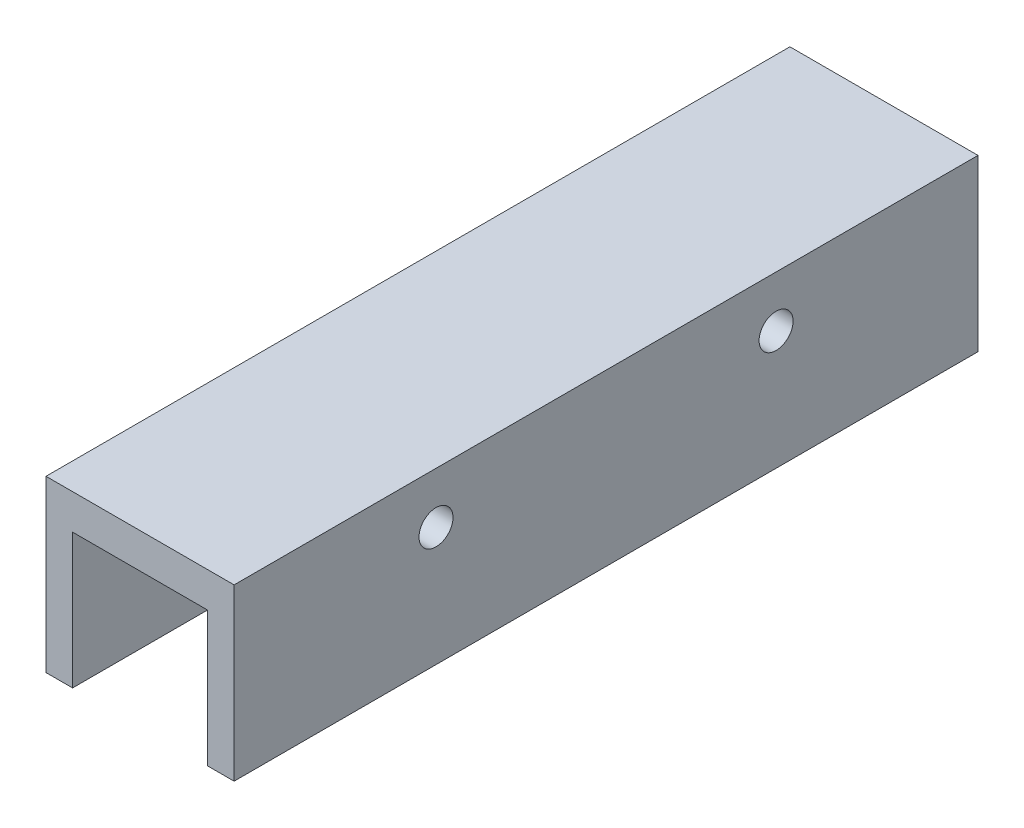
ISO-10303-21;
HEADER;
FILE_DESCRIPTION(('STEP AP214'),'2;1');
FILE_NAME('part.step','',(''),(''),'','','');
FILE_SCHEMA(('AUTOMOTIVE_DESIGN { 1 0 10303 214 1 1 1 1 }'));
ENDSEC;
DATA;
#1=APPLICATION_CONTEXT('core data for automotive mechanical design processes');
#2=APPLICATION_PROTOCOL_DEFINITION('international standard','automotive_design',2000,#1);
#3=PRODUCT_CONTEXT('',#1,'mechanical');
#4=PRODUCT('Part','Part','',(#3));
#5=PRODUCT_RELATED_PRODUCT_CATEGORY('part','',(#4));
#6=PRODUCT_DEFINITION_FORMATION('','',#4);
#7=PRODUCT_DEFINITION_CONTEXT('part definition',#1,'design');
#8=PRODUCT_DEFINITION('design','',#6,#7);
#9=PRODUCT_DEFINITION_SHAPE('','',#8);
#10=(LENGTH_UNIT() NAMED_UNIT(*) SI_UNIT(.MILLI.,.METRE.));
#11=(NAMED_UNIT(*) PLANE_ANGLE_UNIT() SI_UNIT($,.RADIAN.));
#12=(NAMED_UNIT(*) SI_UNIT($,.STERADIAN.) SOLID_ANGLE_UNIT());
#13=UNCERTAINTY_MEASURE_WITH_UNIT(LENGTH_MEASURE(1.E-05),#10,'distance_accuracy_value','');
#14=(GEOMETRIC_REPRESENTATION_CONTEXT(3) GLOBAL_UNCERTAINTY_ASSIGNED_CONTEXT((#13)) GLOBAL_UNIT_ASSIGNED_CONTEXT((#10,
#11,#12)) REPRESENTATION_CONTEXT('',''));
#15=CARTESIAN_POINT('',(0.,0.,0.));
#16=DIRECTION('',(0.,0.,1.));
#17=DIRECTION('',(1.,0.,0.));
#18=AXIS2_PLACEMENT_3D('',#15,#16,#17);
#19=CARTESIAN_POINT('',(3.175,16.129,-88.9));
#20=DIRECTION('',(0.,-1.,0.));
#21=DIRECTION('',(0.,0.,-1.));
#22=AXIS2_PLACEMENT_3D('',#19,#20,#21);
#23=PLANE('',#22);
#24=DIRECTION('',(0.,0.,1.));
#25=VECTOR('',#24,1.);
#26=CARTESIAN_POINT('',(3.175,16.129,-88.9));
#27=LINE('',#26,#25);
#28=CARTESIAN_POINT('',(3.175,16.129,-23.4228939259205));
#29=VERTEX_POINT('',#28);
#30=CARTESIAN_POINT('',(3.175,16.129,0.));
#31=VERTEX_POINT('',#30);
#32=EDGE_CURVE('E162',#29,#31,#27,.T.);
#33=ORIENTED_EDGE('',*,*,#32,.F.);
#34=DIRECTION('',(-1.,0.,0.));
#35=VECTOR('',#34,1.);
#36=CARTESIAN_POINT('',(22.479,16.129,-23.4228939259205));
#37=LINE('',#36,#35);
#38=CARTESIAN_POINT('',(19.304,16.129,-23.4228939259205));
#39=VERTEX_POINT('',#38);
#40=EDGE_CURVE('E63',#29,#39,#37,.F.);
#41=ORIENTED_EDGE('',*,*,#40,.T.);
#42=DIRECTION('',(0.,0.,1.));
#43=VECTOR('',#42,1.);
#44=CARTESIAN_POINT('',(19.304,16.129,-88.9));
#45=LINE('',#44,#43);
#46=CARTESIAN_POINT('',(19.304,16.129,0.));
#47=VERTEX_POINT('',#46);
#48=EDGE_CURVE('E159',#39,#47,#45,.T.);
#49=ORIENTED_EDGE('',*,*,#48,.T.);
#50=DIRECTION('',(1.,0.,0.));
#51=VECTOR('',#50,1.);
#52=CARTESIAN_POINT('',(3.175,16.129,0.));
#53=LINE('',#52,#51);
#54=EDGE_CURVE('E199',#31,#47,#53,.T.);
#55=ORIENTED_EDGE('',*,*,#54,.F.);
#56=EDGE_LOOP('',(#33,#41,#49,#55));
#57=FACE_BOUND('',#56,.T.);
#58=ADVANCED_FACE('F47',(#57),#23,.T.);
#59=CARTESIAN_POINT('',(19.304,16.129,-64.0628939259205));
#60=VERTEX_POINT('',#59);
#61=CARTESIAN_POINT('',(19.304,16.129,-24.8371060740794));
#62=VERTEX_POINT('',#61);
#63=EDGE_CURVE('E165',#60,#62,#45,.T.);
#64=ORIENTED_EDGE('',*,*,#63,.T.);
#65=DIRECTION('',(-1.,0.,0.));
#66=VECTOR('',#65,1.);
#67=CARTESIAN_POINT('',(22.479,16.129,-24.8371060740794));
#68=LINE('',#67,#66);
#69=CARTESIAN_POINT('',(3.175,16.129,-24.8371060740794));
#70=VERTEX_POINT('',#69);
#71=EDGE_CURVE('E244',#62,#70,#68,.T.);
#72=ORIENTED_EDGE('',*,*,#71,.T.);
#73=CARTESIAN_POINT('',(3.175,16.129,-64.0628939259205));
#74=VERTEX_POINT('',#73);
#75=EDGE_CURVE('E160',#74,#70,#27,.T.);
#76=ORIENTED_EDGE('',*,*,#75,.F.);
#77=DIRECTION('',(-1.,0.,0.));
#78=VECTOR('',#77,1.);
#79=CARTESIAN_POINT('',(22.479,16.129,-64.0628939259205));
#80=LINE('',#79,#78);
#81=EDGE_CURVE('E70',#74,#60,#80,.F.);
#82=ORIENTED_EDGE('',*,*,#81,.T.);
#83=EDGE_LOOP('',(#64,#72,#76,#82));
#84=FACE_BOUND('',#83,.T.);
#85=ADVANCED_FACE('F243',(#84),#23,.T.);
#86=CARTESIAN_POINT('',(19.304,16.129,-88.9));
#87=VERTEX_POINT('',#86);
#88=CARTESIAN_POINT('',(19.304,16.129,-65.4771060740795));
#89=VERTEX_POINT('',#88);
#90=EDGE_CURVE('E150',#87,#89,#45,.T.);
#91=ORIENTED_EDGE('',*,*,#90,.T.);
#92=DIRECTION('',(-1.,0.,0.));
#93=VECTOR('',#92,1.);
#94=CARTESIAN_POINT('',(22.479,16.129,-65.4771060740795));
#95=LINE('',#94,#93);
#96=CARTESIAN_POINT('',(3.175,16.129,-65.4771060740795));
#97=VERTEX_POINT('',#96);
#98=EDGE_CURVE('E136',#89,#97,#95,.T.);
#99=ORIENTED_EDGE('',*,*,#98,.T.);
#100=CARTESIAN_POINT('',(3.175,16.129,-88.9));
#101=VERTEX_POINT('',#100);
#102=EDGE_CURVE('E148',#101,#97,#27,.T.);
#103=ORIENTED_EDGE('',*,*,#102,.F.);
#104=DIRECTION('',(1.,0.,0.));
#105=VECTOR('',#104,1.);
#106=CARTESIAN_POINT('',(3.175,16.129,-88.9));
#107=LINE('',#106,#105);
#108=EDGE_CURVE('E261',#101,#87,#107,.T.);
#109=ORIENTED_EDGE('',*,*,#108,.T.);
#110=EDGE_LOOP('',(#91,#99,#103,#109));
#111=FACE_BOUND('',#110,.T.);
#112=ADVANCED_FACE('F146',(#111),#23,.T.);
#113=CARTESIAN_POINT('',(0.,0.,-88.9));
#114=DIRECTION('',(0.,-1.,0.));
#115=DIRECTION('',(0.,0.,-1.));
#116=AXIS2_PLACEMENT_3D('',#113,#114,#115);
#117=PLANE('',#116);
#118=DIRECTION('',(1.,0.,0.));
#119=VECTOR('',#118,1.);
#120=CARTESIAN_POINT('',(0.,0.,0.));
#121=LINE('',#120,#119);
#122=CARTESIAN_POINT('',(0.,0.,0.));
#123=VERTEX_POINT('',#122);
#124=CARTESIAN_POINT('',(3.175,0.,0.));
#125=VERTEX_POINT('',#124);
#126=EDGE_CURVE('E190',#123,#125,#121,.T.);
#127=ORIENTED_EDGE('',*,*,#126,.F.);
#128=DIRECTION('',(0.,0.,1.));
#129=VECTOR('',#128,1.);
#130=CARTESIAN_POINT('',(0.,0.,-88.9));
#131=LINE('',#130,#129);
#132=CARTESIAN_POINT('',(0.,0.,-88.9));
#133=VERTEX_POINT('',#132);
#134=EDGE_CURVE('E143',#133,#123,#131,.T.);
#135=ORIENTED_EDGE('',*,*,#134,.F.);
#136=DIRECTION('',(1.,0.,0.));
#137=VECTOR('',#136,1.);
#138=CARTESIAN_POINT('',(0.,0.,-88.9));
#139=LINE('',#138,#137);
#140=CARTESIAN_POINT('',(3.175,0.,-88.9));
#141=VERTEX_POINT('',#140);
#142=EDGE_CURVE('E223',#133,#141,#139,.T.);
#143=ORIENTED_EDGE('',*,*,#142,.T.);
#144=DIRECTION('',(0.,0.,1.));
#145=VECTOR('',#144,1.);
#146=CARTESIAN_POINT('',(3.175,0.,-88.9));
#147=LINE('',#146,#145);
#148=EDGE_CURVE('E169',#141,#125,#147,.T.);
#149=ORIENTED_EDGE('',*,*,#148,.T.);
#150=EDGE_LOOP('',(#127,#135,#143,#149));
#151=FACE_BOUND('',#150,.T.);
#152=ADVANCED_FACE('F49',(#151),#117,.T.);
#153=CARTESIAN_POINT('',(0.,0.,-88.9));
#154=DIRECTION('',(-1.,0.,0.));
#155=DIRECTION('',(0.,0.,1.));
#156=AXIS2_PLACEMENT_3D('',#153,#154,#155);
#157=PLANE('',#156);
#158=CARTESIAN_POINT('',(0.,14.224,-24.13));
#159=DIRECTION('',(1.,0.,0.));
#160=DIRECTION('',(0.,0.,-1.));
#161=AXIS2_PLACEMENT_3D('',#158,#159,#160);
#162=CIRCLE('',#161,2.032);
#163=CARTESIAN_POINT('',(0.,14.224,-26.162));
#164=VERTEX_POINT('',#163);
#165=EDGE_CURVE('E442',#164,#164,#162,.T.);
#166=ORIENTED_EDGE('',*,*,#165,.T.);
#167=EDGE_LOOP('',(#166));
#168=FACE_BOUND('',#167,.T.);
#169=CARTESIAN_POINT('',(0.,14.224,-64.77));
#170=DIRECTION('',(1.,0.,0.));
#171=DIRECTION('',(0.,0.,-1.));
#172=AXIS2_PLACEMENT_3D('',#169,#170,#171);
#173=CIRCLE('',#172,2.03200000000001);
#174=CARTESIAN_POINT('',(0.,14.224,-66.802));
#175=VERTEX_POINT('',#174);
#176=EDGE_CURVE('E444',#175,#175,#173,.T.);
#177=ORIENTED_EDGE('',*,*,#176,.T.);
#178=EDGE_LOOP('',(#177));
#179=FACE_BOUND('',#178,.T.);
#180=DIRECTION('',(0.,-1.,0.));
#181=VECTOR('',#180,1.);
#182=CARTESIAN_POINT('',(0.,0.,0.));
#183=LINE('',#182,#181);
#184=CARTESIAN_POINT('',(0.,20.32,0.));
#185=VERTEX_POINT('',#184);
#186=EDGE_CURVE('E219',#185,#123,#183,.T.);
#187=ORIENTED_EDGE('',*,*,#186,.F.);
#188=DIRECTION('',(0.,0.,1.));
#189=VECTOR('',#188,1.);
#190=CARTESIAN_POINT('',(0.,20.32,-88.9));
#191=LINE('',#190,#189);
#192=CARTESIAN_POINT('',(0.,20.32,-88.9));
#193=VERTEX_POINT('',#192);
#194=EDGE_CURVE('E226',#193,#185,#191,.T.);
#195=ORIENTED_EDGE('',*,*,#194,.F.);
#196=DIRECTION('',(0.,-1.,0.));
#197=VECTOR('',#196,1.);
#198=CARTESIAN_POINT('',(0.,0.,-88.9));
#199=LINE('',#198,#197);
#200=EDGE_CURVE('E174',#193,#133,#199,.T.);
#201=ORIENTED_EDGE('',*,*,#200,.T.);
#202=ORIENTED_EDGE('',*,*,#134,.T.);
#203=EDGE_LOOP('',(#187,#195,#201,#202));
#204=FACE_BOUND('',#203,.T.);
#205=ADVANCED_FACE('F288',(#168,#179,#204),#157,.T.);
#206=CARTESIAN_POINT('',(0.,20.32,-88.9));
#207=DIRECTION('',(0.,1.,0.));
#208=DIRECTION('',(0.,0.,1.));
#209=AXIS2_PLACEMENT_3D('',#206,#207,#208);
#210=PLANE('',#209);
#211=DIRECTION('',(-1.,0.,0.));
#212=VECTOR('',#211,1.);
#213=CARTESIAN_POINT('',(0.,20.32,0.));
#214=LINE('',#213,#212);
#215=CARTESIAN_POINT('',(22.479,20.32,0.));
#216=VERTEX_POINT('',#215);
#217=EDGE_CURVE('E215',#216,#185,#214,.T.);
#218=ORIENTED_EDGE('',*,*,#217,.F.);
#219=DIRECTION('',(0.,0.,1.));
#220=VECTOR('',#219,1.);
#221=CARTESIAN_POINT('',(22.479,20.32,-88.9));
#222=LINE('',#221,#220);
#223=CARTESIAN_POINT('',(22.479,20.32,-88.9));
#224=VERTEX_POINT('',#223);
#225=EDGE_CURVE('E229',#224,#216,#222,.T.);
#226=ORIENTED_EDGE('',*,*,#225,.F.);
#227=DIRECTION('',(-1.,0.,0.));
#228=VECTOR('',#227,1.);
#229=CARTESIAN_POINT('',(0.,20.32,-88.9));
#230=LINE('',#229,#228);
#231=EDGE_CURVE('E180',#224,#193,#230,.T.);
#232=ORIENTED_EDGE('',*,*,#231,.T.);
#233=ORIENTED_EDGE('',*,*,#194,.T.);
#234=EDGE_LOOP('',(#218,#226,#232,#233));
#235=FACE_BOUND('',#234,.T.);
#236=ADVANCED_FACE('F292',(#235),#210,.T.);
#237=CARTESIAN_POINT('',(22.479,0.,-88.9));
#238=DIRECTION('',(1.,0.,0.));
#239=DIRECTION('',(0.,0.,-1.));
#240=AXIS2_PLACEMENT_3D('',#237,#238,#239);
#241=PLANE('',#240);
#242=CARTESIAN_POINT('',(22.479,14.224,-24.13));
#243=DIRECTION('',(1.,0.,0.));
#244=DIRECTION('',(0.,0.,-1.));
#245=AXIS2_PLACEMENT_3D('',#242,#243,#244);
#246=CIRCLE('',#245,2.032);
#247=CARTESIAN_POINT('',(22.479,14.224,-26.162));
#248=VERTEX_POINT('',#247);
#249=EDGE_CURVE('E152',#248,#248,#246,.T.);
#250=ORIENTED_EDGE('',*,*,#249,.F.);
#251=EDGE_LOOP('',(#250));
#252=FACE_BOUND('',#251,.T.);
#253=CARTESIAN_POINT('',(22.479,14.224,-64.77));
#254=DIRECTION('',(1.,0.,0.));
#255=DIRECTION('',(0.,0.,-1.));
#256=AXIS2_PLACEMENT_3D('',#253,#254,#255);
#257=CIRCLE('',#256,2.03200000000001);
#258=CARTESIAN_POINT('',(22.479,14.224,-66.802));
#259=VERTEX_POINT('',#258);
#260=EDGE_CURVE('E450',#259,#259,#257,.T.);
#261=ORIENTED_EDGE('',*,*,#260,.F.);
#262=EDGE_LOOP('',(#261));
#263=FACE_BOUND('',#262,.T.);
#264=DIRECTION('',(0.,1.,0.));
#265=VECTOR('',#264,1.);
#266=CARTESIAN_POINT('',(22.479,0.,0.));
#267=LINE('',#266,#265);
#268=CARTESIAN_POINT('',(22.479,0.,0.));
#269=VERTEX_POINT('',#268);
#270=EDGE_CURVE('E211',#269,#216,#267,.T.);
#271=ORIENTED_EDGE('',*,*,#270,.F.);
#272=DIRECTION('',(0.,0.,1.));
#273=VECTOR('',#272,1.);
#274=CARTESIAN_POINT('',(22.479,0.,-88.9));
#275=LINE('',#274,#273);
#276=CARTESIAN_POINT('',(22.479,0.,-88.9));
#277=VERTEX_POINT('',#276);
#278=EDGE_CURVE('E232',#277,#269,#275,.T.);
#279=ORIENTED_EDGE('',*,*,#278,.F.);
#280=DIRECTION('',(0.,1.,0.));
#281=VECTOR('',#280,1.);
#282=CARTESIAN_POINT('',(22.479,0.,-88.9));
#283=LINE('',#282,#281);
#284=EDGE_CURVE('E186',#277,#224,#283,.T.);
#285=ORIENTED_EDGE('',*,*,#284,.T.);
#286=ORIENTED_EDGE('',*,*,#225,.T.);
#287=EDGE_LOOP('',(#271,#279,#285,#286));
#288=FACE_BOUND('',#287,.T.);
#289=ADVANCED_FACE('F276',(#252,#263,#288),#241,.T.);
#290=CARTESIAN_POINT('',(19.304,0.,-88.9));
#291=DIRECTION('',(0.,-1.,0.));
#292=DIRECTION('',(0.,0.,-1.));
#293=AXIS2_PLACEMENT_3D('',#290,#291,#292);
#294=PLANE('',#293);
#295=DIRECTION('',(1.,0.,0.));
#296=VECTOR('',#295,1.);
#297=CARTESIAN_POINT('',(19.304,0.,0.));
#298=LINE('',#297,#296);
#299=CARTESIAN_POINT('',(19.304,0.,0.));
#300=VERTEX_POINT('',#299);
#301=EDGE_CURVE('E207',#300,#269,#298,.T.);
#302=ORIENTED_EDGE('',*,*,#301,.F.);
#303=DIRECTION('',(0.,0.,1.));
#304=VECTOR('',#303,1.);
#305=CARTESIAN_POINT('',(19.304,0.,-88.9));
#306=LINE('',#305,#304);
#307=CARTESIAN_POINT('',(19.304,0.,-88.9));
#308=VERTEX_POINT('',#307);
#309=EDGE_CURVE('E235',#308,#300,#306,.T.);
#310=ORIENTED_EDGE('',*,*,#309,.F.);
#311=DIRECTION('',(1.,0.,0.));
#312=VECTOR('',#311,1.);
#313=CARTESIAN_POINT('',(19.304,0.,-88.9));
#314=LINE('',#313,#312);
#315=EDGE_CURVE('E268',#308,#277,#314,.T.);
#316=ORIENTED_EDGE('',*,*,#315,.T.);
#317=ORIENTED_EDGE('',*,*,#278,.T.);
#318=EDGE_LOOP('',(#302,#310,#316,#317));
#319=FACE_BOUND('',#318,.T.);
#320=ADVANCED_FACE('F286',(#319),#294,.T.);
#321=CARTESIAN_POINT('',(19.304,16.129,-88.9));
#322=DIRECTION('',(-1.,0.,0.));
#323=DIRECTION('',(0.,-1.,0.));
#324=AXIS2_PLACEMENT_3D('',#321,#322,#323);
#325=PLANE('',#324);
#326=ORIENTED_EDGE('',*,*,#48,.F.);
#327=CARTESIAN_POINT('',(19.304,14.224,-24.13));
#328=DIRECTION('',(-1.,0.,0.));
#329=DIRECTION('',(0.,-1.,0.));
#330=AXIS2_PLACEMENT_3D('',#327,#328,#329);
#331=CIRCLE('',#330,2.032);
#332=EDGE_CURVE('E195',#39,#62,#331,.F.);
#333=ORIENTED_EDGE('',*,*,#332,.T.);
#334=ORIENTED_EDGE('',*,*,#63,.F.);
#335=CARTESIAN_POINT('',(19.304,14.224,-64.77));
#336=DIRECTION('',(-1.,0.,0.));
#337=DIRECTION('',(0.,-1.,0.));
#338=AXIS2_PLACEMENT_3D('',#335,#336,#337);
#339=CIRCLE('',#338,2.03200000000001);
#340=EDGE_CURVE('E249',#60,#89,#339,.F.);
#341=ORIENTED_EDGE('',*,*,#340,.T.);
#342=ORIENTED_EDGE('',*,*,#90,.F.);
#343=DIRECTION('',(0.,-1.,0.));
#344=VECTOR('',#343,1.);
#345=CARTESIAN_POINT('',(19.304,16.129,-88.9));
#346=LINE('',#345,#344);
#347=EDGE_CURVE('E264',#87,#308,#346,.T.);
#348=ORIENTED_EDGE('',*,*,#347,.T.);
#349=ORIENTED_EDGE('',*,*,#309,.T.);
#350=DIRECTION('',(0.,-1.,0.));
#351=VECTOR('',#350,1.);
#352=CARTESIAN_POINT('',(19.304,16.129,0.));
#353=LINE('',#352,#351);
#354=EDGE_CURVE('E203',#47,#300,#353,.T.);
#355=ORIENTED_EDGE('',*,*,#354,.F.);
#356=EDGE_LOOP('',(#326,#333,#334,#341,#342,#348,#349,#355));
#357=FACE_BOUND('',#356,.T.);
#358=ADVANCED_FACE('F248',(#357),#325,.T.);
#359=CARTESIAN_POINT('',(3.175,0.,-88.9));
#360=DIRECTION('',(1.,0.,0.));
#361=DIRECTION('',(0.,0.,-1.));
#362=AXIS2_PLACEMENT_3D('',#359,#360,#361);
#363=PLANE('',#362);
#364=ORIENTED_EDGE('',*,*,#75,.T.);
#365=CARTESIAN_POINT('',(3.175,14.224,-24.13));
#366=DIRECTION('',(1.,0.,0.));
#367=DIRECTION('',(0.,0.,-1.));
#368=AXIS2_PLACEMENT_3D('',#365,#366,#367);
#369=CIRCLE('',#368,2.032);
#370=EDGE_CURVE('E11',#70,#29,#369,.F.);
#371=ORIENTED_EDGE('',*,*,#370,.T.);
#372=ORIENTED_EDGE('',*,*,#32,.T.);
#373=DIRECTION('',(0.,1.,0.));
#374=VECTOR('',#373,1.);
#375=CARTESIAN_POINT('',(3.175,0.,0.));
#376=LINE('',#375,#374);
#377=EDGE_CURVE('E194',#125,#31,#376,.T.);
#378=ORIENTED_EDGE('',*,*,#377,.F.);
#379=ORIENTED_EDGE('',*,*,#148,.F.);
#380=DIRECTION('',(0.,1.,0.));
#381=VECTOR('',#380,1.);
#382=CARTESIAN_POINT('',(3.175,0.,-88.9));
#383=LINE('',#382,#381);
#384=EDGE_CURVE('E157',#141,#101,#383,.T.);
#385=ORIENTED_EDGE('',*,*,#384,.T.);
#386=ORIENTED_EDGE('',*,*,#102,.T.);
#387=CARTESIAN_POINT('',(3.175,14.224,-64.77));
#388=DIRECTION('',(1.,0.,0.));
#389=DIRECTION('',(0.,0.,-1.));
#390=AXIS2_PLACEMENT_3D('',#387,#388,#389);
#391=CIRCLE('',#390,2.03200000000001);
#392=EDGE_CURVE('E56',#97,#74,#391,.F.);
#393=ORIENTED_EDGE('',*,*,#392,.T.);
#394=EDGE_LOOP('',(#364,#371,#372,#378,#379,#385,#386,#393));
#395=FACE_BOUND('',#394,.T.);
#396=ADVANCED_FACE('F155',(#395),#363,.T.);
#397=CARTESIAN_POINT('',(0.,0.,-88.9));
#398=DIRECTION('',(0.,0.,1.));
#399=DIRECTION('',(1.,0.,0.));
#400=AXIS2_PLACEMENT_3D('',#397,#398,#399);
#401=PLANE('',#400);
#402=ORIENTED_EDGE('',*,*,#142,.F.);
#403=ORIENTED_EDGE('',*,*,#200,.F.);
#404=ORIENTED_EDGE('',*,*,#231,.F.);
#405=ORIENTED_EDGE('',*,*,#284,.F.);
#406=ORIENTED_EDGE('',*,*,#315,.F.);
#407=ORIENTED_EDGE('',*,*,#347,.F.);
#408=ORIENTED_EDGE('',*,*,#108,.F.);
#409=ORIENTED_EDGE('',*,*,#384,.F.);
#410=EDGE_LOOP('',(#402,#403,#404,#405,#406,#407,#408,#409));
#411=FACE_BOUND('',#410,.T.);
#412=ADVANCED_FACE('F282',(#411),#401,.F.);
#413=CARTESIAN_POINT('',(0.,0.,0.));
#414=DIRECTION('',(0.,0.,1.));
#415=DIRECTION('',(1.,0.,0.));
#416=AXIS2_PLACEMENT_3D('',#413,#414,#415);
#417=PLANE('',#416);
#418=ORIENTED_EDGE('',*,*,#126,.T.);
#419=ORIENTED_EDGE('',*,*,#377,.T.);
#420=ORIENTED_EDGE('',*,*,#54,.T.);
#421=ORIENTED_EDGE('',*,*,#354,.T.);
#422=ORIENTED_EDGE('',*,*,#301,.T.);
#423=ORIENTED_EDGE('',*,*,#270,.T.);
#424=ORIENTED_EDGE('',*,*,#217,.T.);
#425=ORIENTED_EDGE('',*,*,#186,.T.);
#426=EDGE_LOOP('',(#418,#419,#420,#421,#422,#423,#424,#425));
#427=FACE_BOUND('',#426,.T.);
#428=ADVANCED_FACE('F290',(#427),#417,.T.);
#429=CARTESIAN_POINT('',(22.479,14.224,-64.77));
#430=DIRECTION('',(-1.,0.,0.));
#431=DIRECTION('',(0.,0.,1.));
#432=AXIS2_PLACEMENT_3D('',#429,#430,#431);
#433=CYLINDRICAL_SURFACE('',#432,2.03200000000001);
#434=ORIENTED_EDGE('',*,*,#81,.F.);
#435=ORIENTED_EDGE('',*,*,#392,.F.);
#436=ORIENTED_EDGE('',*,*,#98,.F.);
#437=ORIENTED_EDGE('',*,*,#340,.F.);
#438=EDGE_LOOP('',(#434,#435,#436,#437));
#439=FACE_BOUND('',#438,.T.);
#440=ORIENTED_EDGE('',*,*,#260,.T.);
#441=EDGE_LOOP('',(#440));
#442=FACE_BOUND('',#441,.T.);
#443=ORIENTED_EDGE('',*,*,#176,.F.);
#444=EDGE_LOOP('',(#443));
#445=FACE_BOUND('',#444,.T.);
#446=ADVANCED_FACE('F134',(#439,#442,#445),#433,.F.);
#447=CARTESIAN_POINT('',(22.479,14.224,-24.13));
#448=DIRECTION('',(-1.,0.,0.));
#449=DIRECTION('',(0.,0.,1.));
#450=AXIS2_PLACEMENT_3D('',#447,#448,#449);
#451=CYLINDRICAL_SURFACE('',#450,2.032);
#452=ORIENTED_EDGE('',*,*,#40,.F.);
#453=ORIENTED_EDGE('',*,*,#370,.F.);
#454=ORIENTED_EDGE('',*,*,#71,.F.);
#455=ORIENTED_EDGE('',*,*,#332,.F.);
#456=EDGE_LOOP('',(#452,#453,#454,#455));
#457=FACE_BOUND('',#456,.T.);
#458=ORIENTED_EDGE('',*,*,#249,.T.);
#459=EDGE_LOOP('',(#458));
#460=FACE_BOUND('',#459,.T.);
#461=ORIENTED_EDGE('',*,*,#165,.F.);
#462=EDGE_LOOP('',(#461));
#463=FACE_BOUND('',#462,.T.);
#464=ADVANCED_FACE('F399',(#457,#460,#463),#451,.F.);
#465=CLOSED_SHELL('',(#58,#85,#112,#152,#205,#236,#289,#320,#358,#396,#412,#428,#446,#464));
#466=MANIFOLD_SOLID_BREP('B2',#465);
#467=ADVANCED_BREP_SHAPE_REPRESENTATION('',(#18,#466),#14);
#468=SHAPE_DEFINITION_REPRESENTATION(#9,#467);
ENDSEC;
END-ISO-10303-21;
